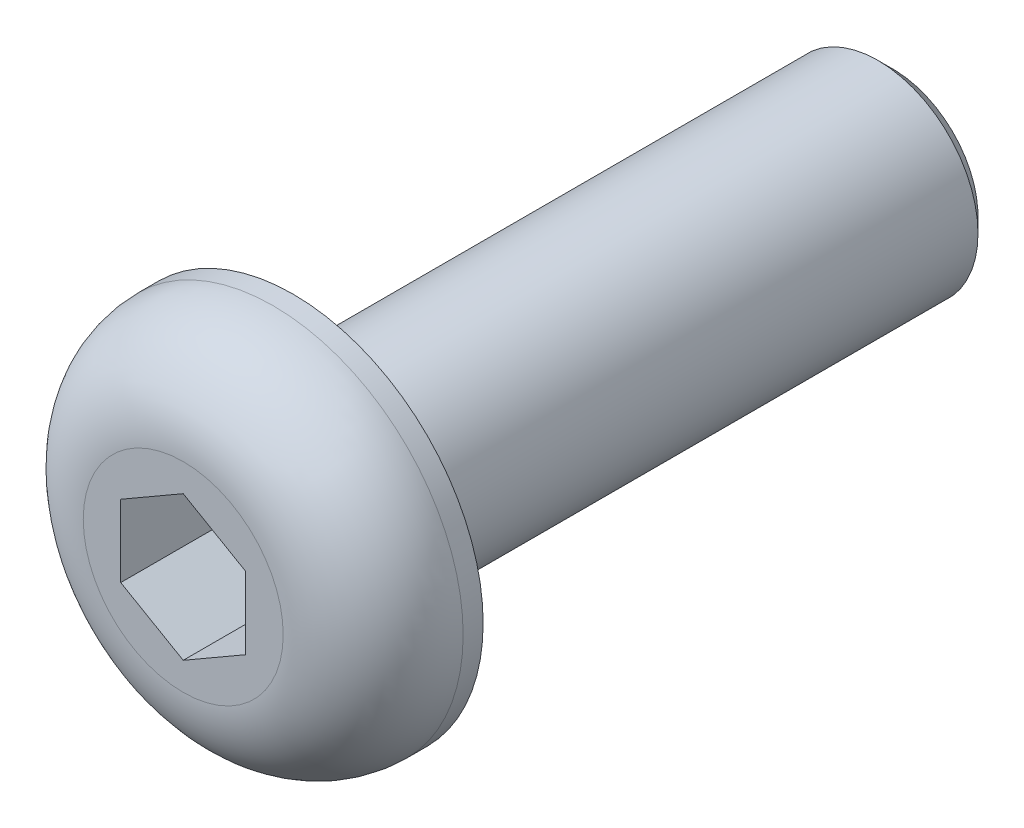
ISO-10303-21;
HEADER;
FILE_DESCRIPTION(('STEP AP214'),'2;1');
FILE_NAME('part.step','',(''),(''),'','','');
FILE_SCHEMA(('AUTOMOTIVE_DESIGN { 1 0 10303 214 1 1 1 1 }'));
ENDSEC;
DATA;
#1=APPLICATION_CONTEXT('core data for automotive mechanical design processes');
#2=APPLICATION_PROTOCOL_DEFINITION('international standard','automotive_design',2000,#1);
#3=PRODUCT_CONTEXT('',#1,'mechanical');
#4=PRODUCT('Part','Part','',(#3));
#5=PRODUCT_RELATED_PRODUCT_CATEGORY('part','',(#4));
#6=PRODUCT_DEFINITION_FORMATION('','',#4);
#7=PRODUCT_DEFINITION_CONTEXT('part definition',#1,'design');
#8=PRODUCT_DEFINITION('design','',#6,#7);
#9=PRODUCT_DEFINITION_SHAPE('','',#8);
#10=(LENGTH_UNIT() NAMED_UNIT(*) SI_UNIT(.MILLI.,.METRE.));
#11=(NAMED_UNIT(*) PLANE_ANGLE_UNIT() SI_UNIT($,.RADIAN.));
#12=(NAMED_UNIT(*) SI_UNIT($,.STERADIAN.) SOLID_ANGLE_UNIT());
#13=UNCERTAINTY_MEASURE_WITH_UNIT(LENGTH_MEASURE(1.E-05),#10,'distance_accuracy_value','');
#14=(GEOMETRIC_REPRESENTATION_CONTEXT(3) GLOBAL_UNCERTAINTY_ASSIGNED_CONTEXT((#13)) GLOBAL_UNIT_ASSIGNED_CONTEXT((#10,
#11,#12)) REPRESENTATION_CONTEXT('',''));
#15=CARTESIAN_POINT('',(0.,0.,0.));
#16=DIRECTION('',(0.,0.,1.));
#17=DIRECTION('',(1.,0.,0.));
#18=AXIS2_PLACEMENT_3D('',#15,#16,#17);
#19=CARTESIAN_POINT('',(0.,0.,2.2));
#20=DIRECTION('',(0.,0.,-1.));
#21=DIRECTION('',(-1.,0.,0.));
#22=AXIS2_PLACEMENT_3D('',#19,#20,#21);
#23=CYLINDRICAL_SURFACE('',#22,3.8);
#24=CARTESIAN_POINT('',(0.,0.,0.4));
#25=DIRECTION('',(0.,0.,1.));
#26=DIRECTION('',(1.,0.,0.));
#27=AXIS2_PLACEMENT_3D('',#24,#25,#26);
#28=CIRCLE('',#27,3.8);
#29=CARTESIAN_POINT('',(3.8,0.,0.4));
#30=VERTEX_POINT('',#29);
#31=EDGE_CURVE('E11',#30,#30,#28,.F.);
#32=ORIENTED_EDGE('',*,*,#31,.T.);
#33=EDGE_LOOP('',(#32));
#34=FACE_BOUND('',#33,.T.);
#35=CARTESIAN_POINT('',(0.,0.,0.));
#36=DIRECTION('',(0.,0.,1.));
#37=DIRECTION('',(1.,0.,0.));
#38=AXIS2_PLACEMENT_3D('',#35,#36,#37);
#39=CIRCLE('',#38,3.8);
#40=CARTESIAN_POINT('',(3.8,0.,0.));
#41=VERTEX_POINT('',#40);
#42=EDGE_CURVE('E137',#41,#41,#39,.T.);
#43=ORIENTED_EDGE('',*,*,#42,.T.);
#44=EDGE_LOOP('',(#43));
#45=FACE_BOUND('',#44,.T.);
#46=ADVANCED_FACE('F35',(#34,#45),#23,.T.);
#47=CARTESIAN_POINT('',(0.,0.,2.2));
#48=DIRECTION('',(0.,0.,1.));
#49=DIRECTION('',(1.,0.,0.));
#50=AXIS2_PLACEMENT_3D('',#47,#48,#49);
#51=PLANE('',#50);
#52=CARTESIAN_POINT('',(0.,0.,2.2));
#53=DIRECTION('',(0.,0.,1.));
#54=DIRECTION('',(1.,0.,0.));
#55=AXIS2_PLACEMENT_3D('',#52,#53,#54);
#56=CIRCLE('',#55,2.);
#57=CARTESIAN_POINT('',(2.,0.,2.2));
#58=VERTEX_POINT('',#57);
#59=EDGE_CURVE('E43',#58,#58,#56,.T.);
#60=ORIENTED_EDGE('',*,*,#59,.T.);
#61=EDGE_LOOP('',(#60));
#62=FACE_BOUND('',#61,.T.);
#63=DIRECTION('',(-0.866025403784439,0.5,0.));
#64=VECTOR('',#63,1.);
#65=CARTESIAN_POINT('',(1.25,0.721687836487033,2.2));
#66=LINE('',#65,#64);
#67=CARTESIAN_POINT('',(1.25,0.721687836487033,2.2));
#68=VERTEX_POINT('',#67);
#69=CARTESIAN_POINT('',(0.,1.44337567297406,2.2));
#70=VERTEX_POINT('',#69);
#71=EDGE_CURVE('E50',#68,#70,#66,.T.);
#72=ORIENTED_EDGE('',*,*,#71,.F.);
#73=DIRECTION('',(0.,1.,0.));
#74=VECTOR('',#73,1.);
#75=CARTESIAN_POINT('',(1.25,-0.721687836487033,2.2));
#76=LINE('',#75,#74);
#77=CARTESIAN_POINT('',(1.25,-0.721687836487033,2.2));
#78=VERTEX_POINT('',#77);
#79=EDGE_CURVE('E133',#78,#68,#76,.T.);
#80=ORIENTED_EDGE('',*,*,#79,.F.);
#81=DIRECTION('',(0.866025403784439,0.5,0.));
#82=VECTOR('',#81,1.);
#83=CARTESIAN_POINT('',(0.,-1.44337567297406,2.2));
#84=LINE('',#83,#82);
#85=CARTESIAN_POINT('',(0.,-1.44337567297406,2.2));
#86=VERTEX_POINT('',#85);
#87=EDGE_CURVE('E131',#86,#78,#84,.T.);
#88=ORIENTED_EDGE('',*,*,#87,.F.);
#89=DIRECTION('',(0.866025403784439,-0.5,0.));
#90=VECTOR('',#89,1.);
#91=CARTESIAN_POINT('',(-1.25,-0.721687836487032,2.2));
#92=LINE('',#91,#90);
#93=CARTESIAN_POINT('',(-1.25,-0.721687836487032,2.2));
#94=VERTEX_POINT('',#93);
#95=EDGE_CURVE('E98',#94,#86,#92,.T.);
#96=ORIENTED_EDGE('',*,*,#95,.F.);
#97=DIRECTION('',(0.,-1.,0.));
#98=VECTOR('',#97,1.);
#99=CARTESIAN_POINT('',(-1.25,0.721687836487033,2.2));
#100=LINE('',#99,#98);
#101=CARTESIAN_POINT('',(-1.25,0.721687836487033,2.2));
#102=VERTEX_POINT('',#101);
#103=EDGE_CURVE('E127',#102,#94,#100,.T.);
#104=ORIENTED_EDGE('',*,*,#103,.F.);
#105=DIRECTION('',(-0.866025403784439,-0.5,0.));
#106=VECTOR('',#105,1.);
#107=CARTESIAN_POINT('',(0.,1.44337567297406,2.2));
#108=LINE('',#107,#106);
#109=EDGE_CURVE('E124',#70,#102,#108,.T.);
#110=ORIENTED_EDGE('',*,*,#109,.F.);
#111=EDGE_LOOP('',(#72,#80,#88,#96,#104,#110));
#112=FACE_BOUND('',#111,.T.);
#113=ADVANCED_FACE('F156',(#62,#112),#51,.T.);
#114=CARTESIAN_POINT('',(0.,0.,0.));
#115=DIRECTION('',(0.,0.,1.));
#116=DIRECTION('',(1.,0.,0.));
#117=AXIS2_PLACEMENT_3D('',#114,#115,#116);
#118=PLANE('',#117);
#119=CARTESIAN_POINT('',(0.,0.,0.));
#120=DIRECTION('',(0.,0.,1.));
#121=DIRECTION('',(1.,0.,0.));
#122=AXIS2_PLACEMENT_3D('',#119,#120,#121);
#123=CIRCLE('',#122,2.);
#124=CARTESIAN_POINT('',(2.,0.,0.));
#125=VERTEX_POINT('',#124);
#126=EDGE_CURVE('E145',#125,#125,#123,.F.);
#127=ORIENTED_EDGE('',*,*,#126,.F.);
#128=EDGE_LOOP('',(#127));
#129=FACE_BOUND('',#128,.T.);
#130=ORIENTED_EDGE('',*,*,#42,.F.);
#131=EDGE_LOOP('',(#130));
#132=FACE_BOUND('',#131,.T.);
#133=ADVANCED_FACE('F173',(#129,#132),#118,.F.);
#134=CARTESIAN_POINT('',(0.,0.,-12.));
#135=DIRECTION('',(0.,0.,1.));
#136=DIRECTION('',(1.,0.,0.));
#137=AXIS2_PLACEMENT_3D('',#134,#135,#136);
#138=CYLINDRICAL_SURFACE('',#137,2.);
#139=CARTESIAN_POINT('',(0.,0.,-11.7));
#140=DIRECTION('',(0.,0.,-1.));
#141=DIRECTION('',(-1.,0.,0.));
#142=AXIS2_PLACEMENT_3D('',#139,#140,#141);
#143=CIRCLE('',#142,2.);
#144=CARTESIAN_POINT('',(-2.,0.,-11.7));
#145=VERTEX_POINT('',#144);
#146=EDGE_CURVE('E151',#145,#145,#143,.F.);
#147=ORIENTED_EDGE('',*,*,#146,.T.);
#148=EDGE_LOOP('',(#147));
#149=FACE_BOUND('',#148,.T.);
#150=ORIENTED_EDGE('',*,*,#126,.T.);
#151=EDGE_LOOP('',(#150));
#152=FACE_BOUND('',#151,.T.);
#153=ADVANCED_FACE('F188',(#149,#152),#138,.T.);
#154=CARTESIAN_POINT('',(0.,0.,-12.));
#155=DIRECTION('',(0.,0.,-1.));
#156=DIRECTION('',(-1.,0.,0.));
#157=AXIS2_PLACEMENT_3D('',#154,#155,#156);
#158=PLANE('',#157);
#159=CARTESIAN_POINT('',(0.,0.,-12.));
#160=DIRECTION('',(0.,0.,-1.));
#161=DIRECTION('',(-1.,0.,0.));
#162=AXIS2_PLACEMENT_3D('',#159,#160,#161);
#163=CIRCLE('',#162,1.7);
#164=CARTESIAN_POINT('',(-1.7,0.,-12.));
#165=VERTEX_POINT('',#164);
#166=EDGE_CURVE('E148',#165,#165,#163,.T.);
#167=ORIENTED_EDGE('',*,*,#166,.T.);
#168=EDGE_LOOP('',(#167));
#169=FACE_BOUND('',#168,.T.);
#170=ADVANCED_FACE('F180',(#169),#158,.T.);
#171=CARTESIAN_POINT('',(0.,0.,-12.));
#172=DIRECTION('',(0.,0.,1.));
#173=DIRECTION('',(1.,0.,0.));
#174=AXIS2_PLACEMENT_3D('',#171,#172,#173);
#175=CONICAL_SURFACE('',#174,1.7,0.785398163397448);
#176=ORIENTED_EDGE('',*,*,#146,.F.);
#177=EDGE_LOOP('',(#176));
#178=FACE_BOUND('',#177,.T.);
#179=ORIENTED_EDGE('',*,*,#166,.F.);
#180=EDGE_LOOP('',(#179));
#181=FACE_BOUND('',#180,.T.);
#182=ADVANCED_FACE('F177',(#178,#181),#175,.T.);
#183=CARTESIAN_POINT('',(1.25,0.721687836487033,0.2));
#184=DIRECTION('',(0.5,0.866025403784439,0.));
#185=DIRECTION('',(-0.866025403784439,0.5,0.));
#186=AXIS2_PLACEMENT_3D('',#183,#184,#185);
#187=PLANE('',#186);
#188=ORIENTED_EDGE('',*,*,#71,.T.);
#189=DIRECTION('',(0.,0.,1.));
#190=VECTOR('',#189,1.);
#191=CARTESIAN_POINT('',(0.,1.44337567297406,0.2));
#192=LINE('',#191,#190);
#193=CARTESIAN_POINT('',(0.,1.44337567297406,0.2));
#194=VERTEX_POINT('',#193);
#195=EDGE_CURVE('E80',#194,#70,#192,.T.);
#196=ORIENTED_EDGE('',*,*,#195,.F.);
#197=DIRECTION('',(-0.866025403784439,0.5,0.));
#198=VECTOR('',#197,1.);
#199=CARTESIAN_POINT('',(1.25,0.721687836487033,0.2));
#200=LINE('',#199,#198);
#201=CARTESIAN_POINT('',(1.25,0.721687836487033,0.2));
#202=VERTEX_POINT('',#201);
#203=EDGE_CURVE('E135',#202,#194,#200,.T.);
#204=ORIENTED_EDGE('',*,*,#203,.F.);
#205=DIRECTION('',(0.,0.,1.));
#206=VECTOR('',#205,1.);
#207=CARTESIAN_POINT('',(1.25,0.721687836487033,0.2));
#208=LINE('',#207,#206);
#209=EDGE_CURVE('E58',#202,#68,#208,.T.);
#210=ORIENTED_EDGE('',*,*,#209,.T.);
#211=EDGE_LOOP('',(#188,#196,#204,#210));
#212=FACE_BOUND('',#211,.T.);
#213=ADVANCED_FACE('F179',(#212),#187,.F.);
#214=CARTESIAN_POINT('',(1.25,-0.721687836487033,0.2));
#215=DIRECTION('',(1.,0.,0.));
#216=DIRECTION('',(0.,1.,0.));
#217=AXIS2_PLACEMENT_3D('',#214,#215,#216);
#218=PLANE('',#217);
#219=ORIENTED_EDGE('',*,*,#79,.T.);
#220=ORIENTED_EDGE('',*,*,#209,.F.);
#221=DIRECTION('',(0.,1.,0.));
#222=VECTOR('',#221,1.);
#223=CARTESIAN_POINT('',(1.25,-0.721687836487033,0.2));
#224=LINE('',#223,#222);
#225=CARTESIAN_POINT('',(1.25,-0.721687836487033,0.2));
#226=VERTEX_POINT('',#225);
#227=EDGE_CURVE('E110',#226,#202,#224,.T.);
#228=ORIENTED_EDGE('',*,*,#227,.F.);
#229=DIRECTION('',(0.,0.,1.));
#230=VECTOR('',#229,1.);
#231=CARTESIAN_POINT('',(1.25,-0.721687836487033,0.2));
#232=LINE('',#231,#230);
#233=EDGE_CURVE('E102',#226,#78,#232,.T.);
#234=ORIENTED_EDGE('',*,*,#233,.T.);
#235=EDGE_LOOP('',(#219,#220,#228,#234));
#236=FACE_BOUND('',#235,.T.);
#237=ADVANCED_FACE('F186',(#236),#218,.F.);
#238=CARTESIAN_POINT('',(0.,-1.44337567297406,0.2));
#239=DIRECTION('',(0.5,-0.866025403784439,0.));
#240=DIRECTION('',(0.866025403784439,0.5,0.));
#241=AXIS2_PLACEMENT_3D('',#238,#239,#240);
#242=PLANE('',#241);
#243=ORIENTED_EDGE('',*,*,#87,.T.);
#244=ORIENTED_EDGE('',*,*,#233,.F.);
#245=DIRECTION('',(0.866025403784439,0.5,0.));
#246=VECTOR('',#245,1.);
#247=CARTESIAN_POINT('',(0.,-1.44337567297406,0.2));
#248=LINE('',#247,#246);
#249=CARTESIAN_POINT('',(0.,-1.44337567297406,0.2));
#250=VERTEX_POINT('',#249);
#251=EDGE_CURVE('E106',#250,#226,#248,.T.);
#252=ORIENTED_EDGE('',*,*,#251,.F.);
#253=DIRECTION('',(0.,0.,1.));
#254=VECTOR('',#253,1.);
#255=CARTESIAN_POINT('',(0.,-1.44337567297406,0.2));
#256=LINE('',#255,#254);
#257=EDGE_CURVE('E91',#250,#86,#256,.T.);
#258=ORIENTED_EDGE('',*,*,#257,.T.);
#259=EDGE_LOOP('',(#243,#244,#252,#258));
#260=FACE_BOUND('',#259,.T.);
#261=ADVANCED_FACE('F107',(#260),#242,.F.);
#262=CARTESIAN_POINT('',(-1.25,-0.721687836487032,0.2));
#263=DIRECTION('',(-0.5,-0.866025403784439,0.));
#264=DIRECTION('',(0.866025403784439,-0.5,0.));
#265=AXIS2_PLACEMENT_3D('',#262,#263,#264);
#266=PLANE('',#265);
#267=ORIENTED_EDGE('',*,*,#95,.T.);
#268=ORIENTED_EDGE('',*,*,#257,.F.);
#269=DIRECTION('',(0.866025403784439,-0.5,0.));
#270=VECTOR('',#269,1.);
#271=CARTESIAN_POINT('',(-1.25,-0.721687836487032,0.2));
#272=LINE('',#271,#270);
#273=CARTESIAN_POINT('',(-1.25,-0.721687836487032,0.2));
#274=VERTEX_POINT('',#273);
#275=EDGE_CURVE('E95',#274,#250,#272,.T.);
#276=ORIENTED_EDGE('',*,*,#275,.F.);
#277=DIRECTION('',(0.,0.,1.));
#278=VECTOR('',#277,1.);
#279=CARTESIAN_POINT('',(-1.25,-0.721687836487032,0.2));
#280=LINE('',#279,#278);
#281=EDGE_CURVE('E103',#274,#94,#280,.T.);
#282=ORIENTED_EDGE('',*,*,#281,.T.);
#283=EDGE_LOOP('',(#267,#268,#276,#282));
#284=FACE_BOUND('',#283,.T.);
#285=ADVANCED_FACE('F93',(#284),#266,.F.);
#286=CARTESIAN_POINT('',(-1.25,0.721687836487033,0.2));
#287=DIRECTION('',(-1.,0.,0.));
#288=DIRECTION('',(0.,0.,1.));
#289=AXIS2_PLACEMENT_3D('',#286,#287,#288);
#290=PLANE('',#289);
#291=ORIENTED_EDGE('',*,*,#103,.T.);
#292=ORIENTED_EDGE('',*,*,#281,.F.);
#293=DIRECTION('',(0.,-1.,0.));
#294=VECTOR('',#293,1.);
#295=CARTESIAN_POINT('',(-1.25,0.721687836487033,0.2));
#296=LINE('',#295,#294);
#297=CARTESIAN_POINT('',(-1.25,0.721687836487033,0.2));
#298=VERTEX_POINT('',#297);
#299=EDGE_CURVE('E116',#298,#274,#296,.T.);
#300=ORIENTED_EDGE('',*,*,#299,.F.);
#301=DIRECTION('',(0.,0.,1.));
#302=VECTOR('',#301,1.);
#303=CARTESIAN_POINT('',(-1.25,0.721687836487033,0.2));
#304=LINE('',#303,#302);
#305=EDGE_CURVE('E140',#298,#102,#304,.T.);
#306=ORIENTED_EDGE('',*,*,#305,.T.);
#307=EDGE_LOOP('',(#291,#292,#300,#306));
#308=FACE_BOUND('',#307,.T.);
#309=ADVANCED_FACE('F250',(#308),#290,.F.);
#310=CARTESIAN_POINT('',(0.,1.44337567297406,0.2));
#311=DIRECTION('',(-0.5,0.866025403784439,0.));
#312=DIRECTION('',(-0.866025403784439,-0.5,0.));
#313=AXIS2_PLACEMENT_3D('',#310,#311,#312);
#314=PLANE('',#313);
#315=ORIENTED_EDGE('',*,*,#109,.T.);
#316=ORIENTED_EDGE('',*,*,#305,.F.);
#317=DIRECTION('',(-0.866025403784439,-0.5,0.));
#318=VECTOR('',#317,1.);
#319=CARTESIAN_POINT('',(0.,1.44337567297406,0.2));
#320=LINE('',#319,#318);
#321=EDGE_CURVE('E118',#194,#298,#320,.T.);
#322=ORIENTED_EDGE('',*,*,#321,.F.);
#323=ORIENTED_EDGE('',*,*,#195,.T.);
#324=EDGE_LOOP('',(#315,#316,#322,#323));
#325=FACE_BOUND('',#324,.T.);
#326=ADVANCED_FACE('F164',(#325),#314,.F.);
#327=CARTESIAN_POINT('',(0.,0.,0.2));
#328=DIRECTION('',(0.,0.,1.));
#329=DIRECTION('',(1.,0.,0.));
#330=AXIS2_PLACEMENT_3D('',#327,#328,#329);
#331=PLANE('',#330);
#332=ORIENTED_EDGE('',*,*,#203,.T.);
#333=ORIENTED_EDGE('',*,*,#321,.T.);
#334=ORIENTED_EDGE('',*,*,#299,.T.);
#335=ORIENTED_EDGE('',*,*,#275,.T.);
#336=ORIENTED_EDGE('',*,*,#251,.T.);
#337=ORIENTED_EDGE('',*,*,#227,.T.);
#338=EDGE_LOOP('',(#332,#333,#334,#335,#336,#337));
#339=FACE_BOUND('',#338,.T.);
#340=ADVANCED_FACE('F113',(#339),#331,.T.);
#341=CARTESIAN_POINT('',(0.,0.,0.4));
#342=DIRECTION('',(0.,0.,1.));
#343=DIRECTION('',(1.,0.,0.));
#344=AXIS2_PLACEMENT_3D('',#341,#342,#343);
#345=TOROIDAL_SURFACE('',#344,2.,1.8);
#346=ORIENTED_EDGE('',*,*,#31,.F.);
#347=EDGE_LOOP('',(#346));
#348=FACE_BOUND('',#347,.T.);
#349=ORIENTED_EDGE('',*,*,#59,.F.);
#350=EDGE_LOOP('',(#349));
#351=FACE_BOUND('',#350,.T.);
#352=ADVANCED_FACE('F37',(#348,#351),#345,.T.);
#353=CLOSED_SHELL('',(#46,#113,#133,#153,#170,#182,#213,#237,#261,#285,#309,#326,#340,#352));
#354=MANIFOLD_SOLID_BREP('B2',#353);
#355=ADVANCED_BREP_SHAPE_REPRESENTATION('',(#18,#354),#14);
#356=SHAPE_DEFINITION_REPRESENTATION(#9,#355);
ENDSEC;
END-ISO-10303-21;
